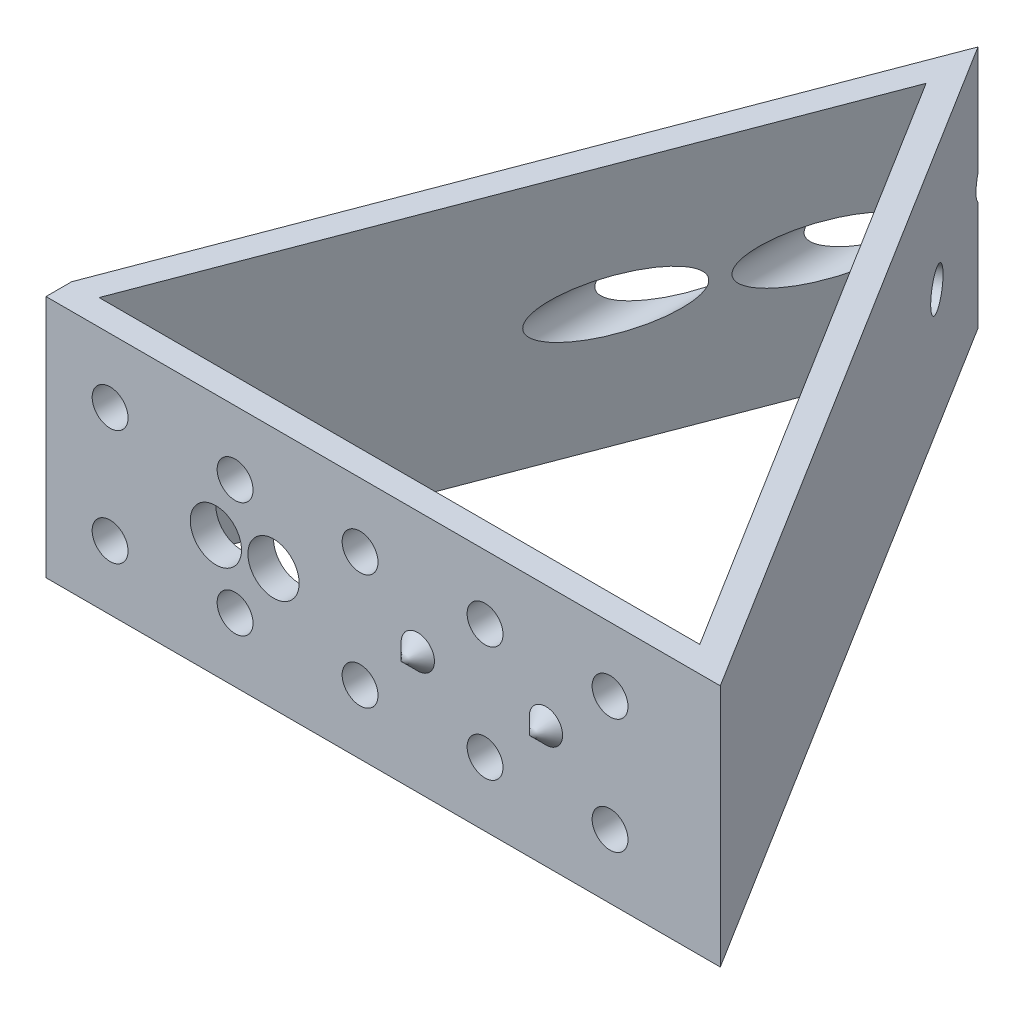
ISO-10303-21;
HEADER;
FILE_DESCRIPTION(('STEP AP214'),'2;1');
FILE_NAME('part.step','',(''),(''),'','','');
FILE_SCHEMA(('AUTOMOTIVE_DESIGN { 1 0 10303 214 1 1 1 1 }'));
ENDSEC;
DATA;
#1=APPLICATION_CONTEXT('core data for automotive mechanical design processes');
#2=APPLICATION_PROTOCOL_DEFINITION('international standard','automotive_design',2000,#1);
#3=PRODUCT_CONTEXT('',#1,'mechanical');
#4=PRODUCT('Part','Part','',(#3));
#5=PRODUCT_RELATED_PRODUCT_CATEGORY('part','',(#4));
#6=PRODUCT_DEFINITION_FORMATION('','',#4);
#7=PRODUCT_DEFINITION_CONTEXT('part definition',#1,'design');
#8=PRODUCT_DEFINITION('design','',#6,#7);
#9=PRODUCT_DEFINITION_SHAPE('','',#8);
#10=(LENGTH_UNIT() NAMED_UNIT(*) SI_UNIT(.MILLI.,.METRE.));
#11=(NAMED_UNIT(*) PLANE_ANGLE_UNIT() SI_UNIT($,.RADIAN.));
#12=(NAMED_UNIT(*) SI_UNIT($,.STERADIAN.) SOLID_ANGLE_UNIT());
#13=UNCERTAINTY_MEASURE_WITH_UNIT(LENGTH_MEASURE(1.E-05),#10,'distance_accuracy_value','');
#14=(GEOMETRIC_REPRESENTATION_CONTEXT(3) GLOBAL_UNCERTAINTY_ASSIGNED_CONTEXT((#13)) GLOBAL_UNIT_ASSIGNED_CONTEXT((#10,
#11,#12)) REPRESENTATION_CONTEXT('',''));
#15=CARTESIAN_POINT('',(0.,0.,0.));
#16=DIRECTION('',(0.,0.,1.));
#17=DIRECTION('',(1.,0.,0.));
#18=AXIS2_PLACEMENT_3D('',#15,#16,#17);
#19=CARTESIAN_POINT('',(-15.5173218956996,30.2385446567147,-17.9808646642624));
#20=DIRECTION('',(0.934610518549132,0.,0.35567285336011));
#21=DIRECTION('',(0.35567285336011,0.,-0.934610518549132));
#22=AXIS2_PLACEMENT_3D('',#19,#20,#21);
#23=PLANE('',#22);
#24=CARTESIAN_POINT('',(-11.25,0.,-29.1942139319328));
#25=DIRECTION('',(0.934610518549132,0.,0.35567285336011));
#26=DIRECTION('',(-0.35567285336011,0.,0.934610518549132));
#27=AXIS2_PLACEMENT_3D('',#24,#25,#26);
#28=ELLIPSE('',#27,5.62314492406608,2.);
#29=CARTESIAN_POINT('',(-13.25,0.,-23.9387635385745));
#30=VERTEX_POINT('',#29);
#31=EDGE_CURVE('E151',#30,#30,#28,.F.);
#32=ORIENTED_EDGE('',*,*,#31,.T.);
#33=EDGE_LOOP('',(#32));
#34=FACE_BOUND('',#33,.T.);
#35=DIRECTION('',(0.35567285336011,0.,-0.934610518549132));
#36=VECTOR('',#35,1.);
#37=CARTESIAN_POINT('',(-15.5173218956996,9.5,-17.9808646642624));
#38=LINE('',#37,#36);
#39=CARTESIAN_POINT('',(-22.3600711630073,9.5,0.));
#40=VERTEX_POINT('',#39);
#41=CARTESIAN_POINT('',(-4.57642849500182,9.49999999999999,-46.7305259274566));
#42=VERTEX_POINT('',#41);
#43=EDGE_CURVE('E139',#40,#42,#38,.T.);
#44=ORIENTED_EDGE('',*,*,#43,.F.);
#45=DIRECTION('',(0.,-1.,0.));
#46=VECTOR('',#45,1.);
#47=CARTESIAN_POINT('',(-22.3600711630073,30.2385446567147,0.));
#48=LINE('',#47,#46);
#49=CARTESIAN_POINT('',(-22.3600711630073,-9.5,0.));
#50=VERTEX_POINT('',#49);
#51=EDGE_CURVE('E54',#40,#50,#48,.T.);
#52=ORIENTED_EDGE('',*,*,#51,.T.);
#53=DIRECTION('',(-0.35567285336011,0.,0.934610518549132));
#54=VECTOR('',#53,1.);
#55=CARTESIAN_POINT('',(-15.5173218956996,-9.5,-17.9808646642624));
#56=LINE('',#55,#54);
#57=CARTESIAN_POINT('',(-4.57642849500182,-9.5,-46.7305259274566));
#58=VERTEX_POINT('',#57);
#59=EDGE_CURVE('E130',#58,#50,#56,.T.);
#60=ORIENTED_EDGE('',*,*,#59,.F.);
#61=DIRECTION('',(0.,-1.,0.));
#62=VECTOR('',#61,1.);
#63=CARTESIAN_POINT('',(-4.57642849500182,79.5050575645304,-46.7305259274566));
#64=LINE('',#63,#62);
#65=EDGE_CURVE('E165',#42,#58,#64,.T.);
#66=ORIENTED_EDGE('',*,*,#65,.F.);
#67=EDGE_LOOP('',(#44,#52,#60,#66));
#68=FACE_BOUND('',#67,.T.);
#69=CARTESIAN_POINT('',(-6.75,0.,-41.018977316989));
#70=DIRECTION('',(0.934610518549132,0.,0.35567285336011));
#71=DIRECTION('',(-0.35567285336011,0.,0.934610518549132));
#72=AXIS2_PLACEMENT_3D('',#69,#70,#71);
#73=ELLIPSE('',#72,5.62314492406608,2.);
#74=CARTESIAN_POINT('',(-8.75,0.,-35.7635269236307));
#75=VERTEX_POINT('',#74);
#76=EDGE_CURVE('E112',#75,#75,#73,.F.);
#77=ORIENTED_EDGE('',*,*,#76,.T.);
#78=EDGE_LOOP('',(#77));
#79=FACE_BOUND('',#78,.T.);
#80=ADVANCED_FACE('F33',(#34,#68,#79),#23,.T.);
#81=CARTESIAN_POINT('',(-24.5,30.2385446567147,0.));
#82=DIRECTION('',(-0.934610518549132,0.,-0.355672853360109));
#83=DIRECTION('',(-0.355672853360109,0.,0.934610518549132));
#84=AXIS2_PLACEMENT_3D('',#81,#82,#83);
#85=PLANE('',#84);
#86=CARTESIAN_POINT('',(-11.25,0.,-34.8173588559989));
#87=DIRECTION('',(-0.934610518549132,0.,-0.355672853360109));
#88=DIRECTION('',(-0.355672853360109,0.,0.934610518549132));
#89=AXIS2_PLACEMENT_3D('',#86,#87,#88);
#90=ELLIPSE('',#89,5.62314492406609,2.);
#91=CARTESIAN_POINT('',(-13.25,0.,-29.5619084626406));
#92=VERTEX_POINT('',#91);
#93=EDGE_CURVE('E149',#92,#92,#90,.F.);
#94=ORIENTED_EDGE('',*,*,#93,.T.);
#95=EDGE_LOOP('',(#94));
#96=FACE_BOUND('',#95,.T.);
#97=DIRECTION('',(0.,-1.,0.));
#98=VECTOR('',#97,1.);
#99=CARTESIAN_POINT('',(-5.01030038253388,79.5050575645304,-51.213574760524));
#100=LINE('',#99,#98);
#101=CARTESIAN_POINT('',(-5.01030038253388,9.49999999999999,-51.213574760524));
#102=VERTEX_POINT('',#101);
#103=CARTESIAN_POINT('',(-5.01030038253388,0.986633285972177,-51.213574760524));
#104=VERTEX_POINT('',#103);
#105=EDGE_CURVE('E111',#102,#104,#100,.T.);
#106=ORIENTED_EDGE('',*,*,#105,.T.);
#107=CARTESIAN_POINT('',(-6.75,0.,-46.6421222410552));
#108=DIRECTION('',(-0.934610518549132,0.,-0.355672853360109));
#109=DIRECTION('',(-0.355672853360109,0.,0.934610518549132));
#110=AXIS2_PLACEMENT_3D('',#107,#108,#109);
#111=ELLIPSE('',#110,5.62314492406608,2.);
#112=CARTESIAN_POINT('',(-5.01030038253389,-0.986633285972183,-51.213574760524));
#113=VERTEX_POINT('',#112);
#114=EDGE_CURVE('E47',#104,#113,#111,.F.);
#115=ORIENTED_EDGE('',*,*,#114,.T.);
#116=CARTESIAN_POINT('',(-5.01030038253388,-9.5,-51.213574760524));
#117=VERTEX_POINT('',#116);
#118=EDGE_CURVE('E109',#113,#117,#100,.T.);
#119=ORIENTED_EDGE('',*,*,#118,.T.);
#120=DIRECTION('',(0.355672853360109,0.,-0.934610518549133));
#121=VECTOR('',#120,1.);
#122=CARTESIAN_POINT('',(-24.5,-9.5,0.));
#123=LINE('',#122,#121);
#124=CARTESIAN_POINT('',(-24.5,-9.5,0.));
#125=VERTEX_POINT('',#124);
#126=EDGE_CURVE('E128',#125,#117,#123,.T.);
#127=ORIENTED_EDGE('',*,*,#126,.F.);
#128=DIRECTION('',(0.,-1.,0.));
#129=VECTOR('',#128,1.);
#130=CARTESIAN_POINT('',(-24.5,9.5,0.));
#131=LINE('',#130,#129);
#132=CARTESIAN_POINT('',(-24.5,9.5,0.));
#133=VERTEX_POINT('',#132);
#134=EDGE_CURVE('E182',#133,#125,#131,.T.);
#135=ORIENTED_EDGE('',*,*,#134,.F.);
#136=DIRECTION('',(-0.355672853360109,0.,0.934610518549132));
#137=VECTOR('',#136,1.);
#138=CARTESIAN_POINT('',(-24.5,9.5,0.));
#139=LINE('',#138,#137);
#140=EDGE_CURVE('E134',#102,#133,#139,.T.);
#141=ORIENTED_EDGE('',*,*,#140,.F.);
#142=EDGE_LOOP('',(#106,#115,#119,#127,#135,#141));
#143=FACE_BOUND('',#142,.T.);
#144=ADVANCED_FACE('F107',(#96,#143),#85,.T.);
#145=CARTESIAN_POINT('',(28.0999775520594,79.5050575645304,2.));
#146=DIRECTION('',(0.849059400777216,0.,-0.528297391581517));
#147=DIRECTION('',(-0.528297391581517,0.,-0.849059400777216));
#148=AXIS2_PLACEMENT_3D('',#145,#146,#147);
#149=PLANE('',#148);
#150=CARTESIAN_POINT('',(0.272673533281302,0.,-42.7229807527518));
#151=DIRECTION('',(0.849059400777216,0.,-0.528297391581517));
#152=DIRECTION('',(-0.528297391581517,0.,-0.849059400777216));
#153=AXIS2_PLACEMENT_3D('',#150,#151,#152);
#154=CIRCLE('',#153,1.5);
#155=CARTESIAN_POINT('',(-0.519772554090975,0.,-43.9965698539176));
#156=VERTEX_POINT('',#155);
#157=EDGE_CURVE('E585',#156,#156,#154,.T.);
#158=ORIENTED_EDGE('',*,*,#157,.F.);
#159=EDGE_LOOP('',(#158));
#160=FACE_BOUND('',#159,.T.);
#161=ORIENTED_EDGE('',*,*,#118,.F.);
#162=CARTESIAN_POINT('',(-6.75,0.,-54.0095535752523));
#163=DIRECTION('',(0.849059400777216,0.,-0.528297391581517));
#164=DIRECTION('',(0.528297391581517,0.,0.849059400777216));
#165=AXIS2_PLACEMENT_3D('',#162,#163,#164);
#166=ELLIPSE('',#165,3.78574649784428,2.);
#167=EDGE_CURVE('E11',#113,#104,#166,.F.);
#168=ORIENTED_EDGE('',*,*,#167,.T.);
#169=ORIENTED_EDGE('',*,*,#105,.F.);
#170=DIRECTION('',(-0.528297391581517,0.,-0.849059400777216));
#171=VECTOR('',#170,1.);
#172=CARTESIAN_POINT('',(28.0999775520594,9.49999999999999,2.));
#173=LINE('',#172,#171);
#174=CARTESIAN_POINT('',(28.0999775520594,9.49999999999999,2.));
#175=VERTEX_POINT('',#174);
#176=EDGE_CURVE('E162',#175,#102,#173,.T.);
#177=ORIENTED_EDGE('',*,*,#176,.F.);
#178=DIRECTION('',(0.,-1.,0.));
#179=VECTOR('',#178,1.);
#180=CARTESIAN_POINT('',(28.0999775520594,79.5050575645304,2.));
#181=LINE('',#180,#179);
#182=CARTESIAN_POINT('',(28.0999775520594,-9.5,2.));
#183=VERTEX_POINT('',#182);
#184=EDGE_CURVE('E122',#175,#183,#181,.T.);
#185=ORIENTED_EDGE('',*,*,#184,.T.);
#186=DIRECTION('',(0.528297391581517,0.,0.849059400777216));
#187=VECTOR('',#186,1.);
#188=CARTESIAN_POINT('',(28.0999775520594,-9.5,2.));
#189=LINE('',#188,#187);
#190=EDGE_CURVE('E119',#117,#183,#189,.T.);
#191=ORIENTED_EDGE('',*,*,#190,.F.);
#192=EDGE_LOOP('',(#161,#168,#169,#177,#185,#191));
#193=FACE_BOUND('',#192,.T.);
#194=ADVANCED_FACE('F116',(#160,#193),#149,.T.);
#195=CARTESIAN_POINT('',(0.,0.,0.));
#196=DIRECTION('',(0.,0.,1.));
#197=DIRECTION('',(1.,0.,0.));
#198=AXIS2_PLACEMENT_3D('',#195,#196,#197);
#199=PLANE('',#198);
#200=CARTESIAN_POINT('',(19.5,4.5,0.));
#201=DIRECTION('',(0.,0.,1.));
#202=DIRECTION('',(1.,0.,0.));
#203=AXIS2_PLACEMENT_3D('',#200,#201,#202);
#204=CIRCLE('',#203,1.4);
#205=CARTESIAN_POINT('',(20.9,4.5,0.));
#206=VERTEX_POINT('',#205);
#207=EDGE_CURVE('E185',#206,#206,#204,.T.);
#208=ORIENTED_EDGE('',*,*,#207,.T.);
#209=EDGE_LOOP('',(#208));
#210=FACE_BOUND('',#209,.T.);
#211=CARTESIAN_POINT('',(9.75,4.5,0.));
#212=DIRECTION('',(0.,0.,1.));
#213=DIRECTION('',(1.,0.,0.));
#214=AXIS2_PLACEMENT_3D('',#211,#212,#213);
#215=CIRCLE('',#214,1.4);
#216=CARTESIAN_POINT('',(11.15,4.5,0.));
#217=VERTEX_POINT('',#216);
#218=EDGE_CURVE('E218',#217,#217,#215,.T.);
#219=ORIENTED_EDGE('',*,*,#218,.T.);
#220=EDGE_LOOP('',(#219));
#221=FACE_BOUND('',#220,.T.);
#222=CARTESIAN_POINT('',(0.,4.5,0.));
#223=DIRECTION('',(0.,0.,1.));
#224=DIRECTION('',(1.,0.,0.));
#225=AXIS2_PLACEMENT_3D('',#222,#223,#224);
#226=CIRCLE('',#225,1.4);
#227=CARTESIAN_POINT('',(1.4,4.5,0.));
#228=VERTEX_POINT('',#227);
#229=EDGE_CURVE('E223',#228,#228,#226,.T.);
#230=ORIENTED_EDGE('',*,*,#229,.T.);
#231=EDGE_LOOP('',(#230));
#232=FACE_BOUND('',#231,.T.);
#233=CARTESIAN_POINT('',(-9.75,4.5,0.));
#234=DIRECTION('',(0.,0.,1.));
#235=DIRECTION('',(1.,0.,0.));
#236=AXIS2_PLACEMENT_3D('',#233,#234,#235);
#237=CIRCLE('',#236,1.4);
#238=CARTESIAN_POINT('',(-8.35,4.5,0.));
#239=VERTEX_POINT('',#238);
#240=EDGE_CURVE('E229',#239,#239,#237,.T.);
#241=ORIENTED_EDGE('',*,*,#240,.T.);
#242=EDGE_LOOP('',(#241));
#243=FACE_BOUND('',#242,.T.);
#244=CARTESIAN_POINT('',(-19.5,4.5,0.));
#245=DIRECTION('',(0.,0.,1.));
#246=DIRECTION('',(1.,0.,0.));
#247=AXIS2_PLACEMENT_3D('',#244,#245,#246);
#248=CIRCLE('',#247,1.4);
#249=CARTESIAN_POINT('',(-18.1,4.5,0.));
#250=VERTEX_POINT('',#249);
#251=EDGE_CURVE('E235',#250,#250,#248,.T.);
#252=ORIENTED_EDGE('',*,*,#251,.T.);
#253=EDGE_LOOP('',(#252));
#254=FACE_BOUND('',#253,.T.);
#255=CARTESIAN_POINT('',(-19.5,-4.5,0.));
#256=DIRECTION('',(0.,0.,1.));
#257=DIRECTION('',(1.,0.,0.));
#258=AXIS2_PLACEMENT_3D('',#255,#256,#257);
#259=CIRCLE('',#258,1.4);
#260=CARTESIAN_POINT('',(-18.1,-4.5,0.));
#261=VERTEX_POINT('',#260);
#262=EDGE_CURVE('E241',#261,#261,#259,.T.);
#263=ORIENTED_EDGE('',*,*,#262,.T.);
#264=EDGE_LOOP('',(#263));
#265=FACE_BOUND('',#264,.T.);
#266=CARTESIAN_POINT('',(-9.75,-4.5,0.));
#267=DIRECTION('',(0.,0.,1.));
#268=DIRECTION('',(1.,0.,0.));
#269=AXIS2_PLACEMENT_3D('',#266,#267,#268);
#270=CIRCLE('',#269,1.4);
#271=CARTESIAN_POINT('',(-8.35,-4.5,0.));
#272=VERTEX_POINT('',#271);
#273=EDGE_CURVE('E247',#272,#272,#270,.T.);
#274=ORIENTED_EDGE('',*,*,#273,.T.);
#275=EDGE_LOOP('',(#274));
#276=FACE_BOUND('',#275,.T.);
#277=CARTESIAN_POINT('',(0.,-4.5,0.));
#278=DIRECTION('',(0.,0.,1.));
#279=DIRECTION('',(1.,0.,0.));
#280=AXIS2_PLACEMENT_3D('',#277,#278,#279);
#281=CIRCLE('',#280,1.4);
#282=CARTESIAN_POINT('',(1.4,-4.5,0.));
#283=VERTEX_POINT('',#282);
#284=EDGE_CURVE('E253',#283,#283,#281,.T.);
#285=ORIENTED_EDGE('',*,*,#284,.T.);
#286=EDGE_LOOP('',(#285));
#287=FACE_BOUND('',#286,.T.);
#288=CARTESIAN_POINT('',(9.75,-4.5,0.));
#289=DIRECTION('',(0.,0.,1.));
#290=DIRECTION('',(1.,0.,0.));
#291=AXIS2_PLACEMENT_3D('',#288,#289,#290);
#292=CIRCLE('',#291,1.4);
#293=CARTESIAN_POINT('',(11.15,-4.5,0.));
#294=VERTEX_POINT('',#293);
#295=EDGE_CURVE('E259',#294,#294,#292,.T.);
#296=ORIENTED_EDGE('',*,*,#295,.T.);
#297=EDGE_LOOP('',(#296));
#298=FACE_BOUND('',#297,.T.);
#299=CARTESIAN_POINT('',(19.5,-4.5,0.));
#300=DIRECTION('',(0.,0.,1.));
#301=DIRECTION('',(1.,0.,0.));
#302=AXIS2_PLACEMENT_3D('',#299,#300,#301);
#303=CIRCLE('',#302,1.4);
#304=CARTESIAN_POINT('',(20.9,-4.5,0.));
#305=VERTEX_POINT('',#304);
#306=EDGE_CURVE('E265',#305,#305,#303,.T.);
#307=ORIENTED_EDGE('',*,*,#306,.T.);
#308=EDGE_LOOP('',(#307));
#309=FACE_BOUND('',#308,.T.);
#310=CARTESIAN_POINT('',(-6.75,0.,0.));
#311=DIRECTION('',(0.,0.,1.));
#312=DIRECTION('',(1.,0.,0.));
#313=AXIS2_PLACEMENT_3D('',#310,#311,#312);
#314=CIRCLE('',#313,2.);
#315=CARTESIAN_POINT('',(-4.75,0.,0.));
#316=VERTEX_POINT('',#315);
#317=EDGE_CURVE('E210',#316,#316,#314,.T.);
#318=ORIENTED_EDGE('',*,*,#317,.T.);
#319=EDGE_LOOP('',(#318));
#320=FACE_BOUND('',#319,.T.);
#321=CARTESIAN_POINT('',(-11.25,0.,0.));
#322=DIRECTION('',(0.,0.,1.));
#323=DIRECTION('',(1.,0.,0.));
#324=AXIS2_PLACEMENT_3D('',#321,#322,#323);
#325=CIRCLE('',#324,2.);
#326=CARTESIAN_POINT('',(-9.25,0.,0.));
#327=VERTEX_POINT('',#326);
#328=EDGE_CURVE('E205',#327,#327,#325,.T.);
#329=ORIENTED_EDGE('',*,*,#328,.T.);
#330=EDGE_LOOP('',(#329));
#331=FACE_BOUND('',#330,.T.);
#332=ORIENTED_EDGE('',*,*,#51,.F.);
#333=DIRECTION('',(-1.,0.,0.));
#334=VECTOR('',#333,1.);
#335=CARTESIAN_POINT('',(-24.5,9.5,0.));
#336=LINE('',#335,#334);
#337=CARTESIAN_POINT('',(24.5,9.5,0.));
#338=VERTEX_POINT('',#337);
#339=EDGE_CURVE('E198',#338,#40,#336,.T.);
#340=ORIENTED_EDGE('',*,*,#339,.F.);
#341=DIRECTION('',(0.,1.,0.));
#342=VECTOR('',#341,1.);
#343=CARTESIAN_POINT('',(24.5,9.5,0.));
#344=LINE('',#343,#342);
#345=CARTESIAN_POINT('',(24.5,-9.5,0.));
#346=VERTEX_POINT('',#345);
#347=EDGE_CURVE('E188',#346,#338,#344,.T.);
#348=ORIENTED_EDGE('',*,*,#347,.F.);
#349=DIRECTION('',(1.,0.,0.));
#350=VECTOR('',#349,1.);
#351=CARTESIAN_POINT('',(-24.5,-9.5,0.));
#352=LINE('',#351,#350);
#353=EDGE_CURVE('E140',#50,#346,#352,.T.);
#354=ORIENTED_EDGE('',*,*,#353,.F.);
#355=EDGE_LOOP('',(#332,#340,#348,#354));
#356=FACE_BOUND('',#355,.T.);
#357=ADVANCED_FACE('F288',(#210,#221,#232,#243,#254,#265,#276,#287,#298,#309,#320,#331,#356),
#199,.F.);
#358=CARTESIAN_POINT('',(0.,0.,2.));
#359=DIRECTION('',(0.,0.,1.));
#360=DIRECTION('',(1.,0.,0.));
#361=AXIS2_PLACEMENT_3D('',#358,#359,#360);
#362=PLANE('',#361);
#363=CARTESIAN_POINT('',(4.5,0.,2.));
#364=DIRECTION('',(0.,0.,1.));
#365=DIRECTION('',(1.,0.,0.));
#366=AXIS2_PLACEMENT_3D('',#363,#364,#365);
#367=CIRCLE('',#366,1.3);
#368=CARTESIAN_POINT('',(5.8,0.,2.));
#369=VERTEX_POINT('',#368);
#370=EDGE_CURVE('E276',#369,#369,#367,.T.);
#371=ORIENTED_EDGE('',*,*,#370,.F.);
#372=EDGE_LOOP('',(#371));
#373=FACE_BOUND('',#372,.T.);
#374=CARTESIAN_POINT('',(-11.25,0.,2.));
#375=DIRECTION('',(0.,0.,1.));
#376=DIRECTION('',(1.,0.,0.));
#377=AXIS2_PLACEMENT_3D('',#374,#375,#376);
#378=CIRCLE('',#377,2.);
#379=CARTESIAN_POINT('',(-9.25,0.,2.));
#380=VERTEX_POINT('',#379);
#381=EDGE_CURVE('E209',#380,#380,#378,.T.);
#382=ORIENTED_EDGE('',*,*,#381,.F.);
#383=EDGE_LOOP('',(#382));
#384=FACE_BOUND('',#383,.T.);
#385=CARTESIAN_POINT('',(-6.75,0.,2.));
#386=DIRECTION('',(0.,0.,1.));
#387=DIRECTION('',(1.,0.,0.));
#388=AXIS2_PLACEMENT_3D('',#385,#386,#387);
#389=CIRCLE('',#388,2.);
#390=CARTESIAN_POINT('',(-4.75,0.,2.));
#391=VERTEX_POINT('',#390);
#392=EDGE_CURVE('E208',#391,#391,#389,.T.);
#393=ORIENTED_EDGE('',*,*,#392,.F.);
#394=EDGE_LOOP('',(#393));
#395=FACE_BOUND('',#394,.T.);
#396=CARTESIAN_POINT('',(19.5,-4.5,2.));
#397=DIRECTION('',(0.,0.,1.));
#398=DIRECTION('',(1.,0.,0.));
#399=AXIS2_PLACEMENT_3D('',#396,#397,#398);
#400=CIRCLE('',#399,1.4);
#401=CARTESIAN_POINT('',(20.9,-4.5,2.));
#402=VERTEX_POINT('',#401);
#403=EDGE_CURVE('E212',#402,#402,#400,.T.);
#404=ORIENTED_EDGE('',*,*,#403,.F.);
#405=EDGE_LOOP('',(#404));
#406=FACE_BOUND('',#405,.T.);
#407=CARTESIAN_POINT('',(9.75,-4.5,2.));
#408=DIRECTION('',(0.,0.,1.));
#409=DIRECTION('',(1.,0.,0.));
#410=AXIS2_PLACEMENT_3D('',#407,#408,#409);
#411=CIRCLE('',#410,1.4);
#412=CARTESIAN_POINT('',(11.15,-4.5,2.));
#413=VERTEX_POINT('',#412);
#414=EDGE_CURVE('E262',#413,#413,#411,.T.);
#415=ORIENTED_EDGE('',*,*,#414,.F.);
#416=EDGE_LOOP('',(#415));
#417=FACE_BOUND('',#416,.T.);
#418=CARTESIAN_POINT('',(0.,-4.5,2.));
#419=DIRECTION('',(0.,0.,1.));
#420=DIRECTION('',(1.,0.,0.));
#421=AXIS2_PLACEMENT_3D('',#418,#419,#420);
#422=CIRCLE('',#421,1.4);
#423=CARTESIAN_POINT('',(1.4,-4.5,2.));
#424=VERTEX_POINT('',#423);
#425=EDGE_CURVE('E256',#424,#424,#422,.T.);
#426=ORIENTED_EDGE('',*,*,#425,.F.);
#427=EDGE_LOOP('',(#426));
#428=FACE_BOUND('',#427,.T.);
#429=CARTESIAN_POINT('',(-9.75,-4.5,2.));
#430=DIRECTION('',(0.,0.,1.));
#431=DIRECTION('',(1.,0.,0.));
#432=AXIS2_PLACEMENT_3D('',#429,#430,#431);
#433=CIRCLE('',#432,1.4);
#434=CARTESIAN_POINT('',(-8.35,-4.5,2.));
#435=VERTEX_POINT('',#434);
#436=EDGE_CURVE('E250',#435,#435,#433,.T.);
#437=ORIENTED_EDGE('',*,*,#436,.F.);
#438=EDGE_LOOP('',(#437));
#439=FACE_BOUND('',#438,.T.);
#440=CARTESIAN_POINT('',(-19.5,-4.5,2.));
#441=DIRECTION('',(0.,0.,1.));
#442=DIRECTION('',(1.,0.,0.));
#443=AXIS2_PLACEMENT_3D('',#440,#441,#442);
#444=CIRCLE('',#443,1.4);
#445=CARTESIAN_POINT('',(-18.1,-4.5,2.));
#446=VERTEX_POINT('',#445);
#447=EDGE_CURVE('E244',#446,#446,#444,.T.);
#448=ORIENTED_EDGE('',*,*,#447,.F.);
#449=EDGE_LOOP('',(#448));
#450=FACE_BOUND('',#449,.T.);
#451=CARTESIAN_POINT('',(-19.5,4.5,2.));
#452=DIRECTION('',(0.,0.,1.));
#453=DIRECTION('',(1.,0.,0.));
#454=AXIS2_PLACEMENT_3D('',#451,#452,#453);
#455=CIRCLE('',#454,1.4);
#456=CARTESIAN_POINT('',(-18.1,4.5,2.));
#457=VERTEX_POINT('',#456);
#458=EDGE_CURVE('E238',#457,#457,#455,.T.);
#459=ORIENTED_EDGE('',*,*,#458,.F.);
#460=EDGE_LOOP('',(#459));
#461=FACE_BOUND('',#460,.T.);
#462=CARTESIAN_POINT('',(-9.75,4.5,2.));
#463=DIRECTION('',(0.,0.,1.));
#464=DIRECTION('',(1.,0.,0.));
#465=AXIS2_PLACEMENT_3D('',#462,#463,#464);
#466=CIRCLE('',#465,1.4);
#467=CARTESIAN_POINT('',(-8.35,4.5,2.));
#468=VERTEX_POINT('',#467);
#469=EDGE_CURVE('E232',#468,#468,#466,.T.);
#470=ORIENTED_EDGE('',*,*,#469,.F.);
#471=EDGE_LOOP('',(#470));
#472=FACE_BOUND('',#471,.T.);
#473=CARTESIAN_POINT('',(0.,4.5,2.));
#474=DIRECTION('',(0.,0.,1.));
#475=DIRECTION('',(1.,0.,0.));
#476=AXIS2_PLACEMENT_3D('',#473,#474,#475);
#477=CIRCLE('',#476,1.4);
#478=CARTESIAN_POINT('',(1.4,4.5,2.));
#479=VERTEX_POINT('',#478);
#480=EDGE_CURVE('E226',#479,#479,#477,.T.);
#481=ORIENTED_EDGE('',*,*,#480,.F.);
#482=EDGE_LOOP('',(#481));
#483=FACE_BOUND('',#482,.T.);
#484=CARTESIAN_POINT('',(9.75,4.5,2.));
#485=DIRECTION('',(0.,0.,1.));
#486=DIRECTION('',(1.,0.,0.));
#487=AXIS2_PLACEMENT_3D('',#484,#485,#486);
#488=CIRCLE('',#487,1.4);
#489=CARTESIAN_POINT('',(11.15,4.5,2.));
#490=VERTEX_POINT('',#489);
#491=EDGE_CURVE('E220',#490,#490,#488,.T.);
#492=ORIENTED_EDGE('',*,*,#491,.F.);
#493=EDGE_LOOP('',(#492));
#494=FACE_BOUND('',#493,.T.);
#495=CARTESIAN_POINT('',(19.5,4.5,2.));
#496=DIRECTION('',(0.,0.,1.));
#497=DIRECTION('',(1.,0.,0.));
#498=AXIS2_PLACEMENT_3D('',#495,#496,#497);
#499=CIRCLE('',#498,1.4);
#500=CARTESIAN_POINT('',(20.9,4.5,2.));
#501=VERTEX_POINT('',#500);
#502=EDGE_CURVE('E190',#501,#501,#499,.T.);
#503=ORIENTED_EDGE('',*,*,#502,.F.);
#504=EDGE_LOOP('',(#503));
#505=FACE_BOUND('',#504,.T.);
#506=DIRECTION('',(0.,-1.,0.));
#507=VECTOR('',#506,1.);
#508=CARTESIAN_POINT('',(-24.5,9.5,2.));
#509=LINE('',#508,#507);
#510=CARTESIAN_POINT('',(-24.5,9.5,2.));
#511=VERTEX_POINT('',#510);
#512=CARTESIAN_POINT('',(-24.5,-9.5,2.));
#513=VERTEX_POINT('',#512);
#514=EDGE_CURVE('E204',#511,#513,#509,.T.);
#515=ORIENTED_EDGE('',*,*,#514,.T.);
#516=DIRECTION('',(1.,0.,0.));
#517=VECTOR('',#516,1.);
#518=CARTESIAN_POINT('',(-24.5,-9.5,2.));
#519=LINE('',#518,#517);
#520=EDGE_CURVE('E177',#513,#183,#519,.T.);
#521=ORIENTED_EDGE('',*,*,#520,.T.);
#522=ORIENTED_EDGE('',*,*,#184,.F.);
#523=DIRECTION('',(-1.,0.,0.));
#524=VECTOR('',#523,1.);
#525=CARTESIAN_POINT('',(-24.5,9.5,2.));
#526=LINE('',#525,#524);
#527=EDGE_CURVE('E193',#175,#511,#526,.T.);
#528=ORIENTED_EDGE('',*,*,#527,.T.);
#529=EDGE_LOOP('',(#515,#521,#522,#528));
#530=FACE_BOUND('',#529,.T.);
#531=CARTESIAN_POINT('',(14.5,0.,2.));
#532=DIRECTION('',(0.,0.,1.));
#533=DIRECTION('',(1.,0.,0.));
#534=AXIS2_PLACEMENT_3D('',#531,#532,#533);
#535=CIRCLE('',#534,1.3);
#536=CARTESIAN_POINT('',(15.8,0.,2.));
#537=VERTEX_POINT('',#536);
#538=EDGE_CURVE('E278',#537,#537,#535,.T.);
#539=ORIENTED_EDGE('',*,*,#538,.F.);
#540=EDGE_LOOP('',(#539));
#541=FACE_BOUND('',#540,.T.);
#542=ADVANCED_FACE('F285',(#373,#384,#395,#406,#417,#428,#439,#450,#461,#472,#483,#494,#505,
#530,#541),#362,.T.);
#543=CARTESIAN_POINT('',(-24.5,9.5,2.));
#544=DIRECTION('',(1.,0.,0.));
#545=DIRECTION('',(0.,0.,-1.));
#546=AXIS2_PLACEMENT_3D('',#543,#544,#545);
#547=PLANE('',#546);
#548=ORIENTED_EDGE('',*,*,#134,.T.);
#549=DIRECTION('',(0.,0.,-1.));
#550=VECTOR('',#549,1.);
#551=CARTESIAN_POINT('',(-24.5,-9.5,2.));
#552=LINE('',#551,#550);
#553=EDGE_CURVE('E41',#513,#125,#552,.T.);
#554=ORIENTED_EDGE('',*,*,#553,.F.);
#555=ORIENTED_EDGE('',*,*,#514,.F.);
#556=DIRECTION('',(0.,0.,-1.));
#557=VECTOR('',#556,1.);
#558=CARTESIAN_POINT('',(-24.5,9.5,2.));
#559=LINE('',#558,#557);
#560=EDGE_CURVE('E201',#511,#133,#559,.T.);
#561=ORIENTED_EDGE('',*,*,#560,.T.);
#562=EDGE_LOOP('',(#548,#554,#555,#561));
#563=FACE_BOUND('',#562,.T.);
#564=ADVANCED_FACE('F284',(#563),#547,.F.);
#565=CARTESIAN_POINT('',(-24.5,-9.5,2.));
#566=DIRECTION('',(0.,1.,0.));
#567=DIRECTION('',(0.,0.,1.));
#568=AXIS2_PLACEMENT_3D('',#565,#566,#567);
#569=PLANE('',#568);
#570=ORIENTED_EDGE('',*,*,#353,.T.);
#571=DIRECTION('',(-0.528297391581518,0.,-0.849059400777216));
#572=VECTOR('',#571,1.);
#573=CARTESIAN_POINT('',(-4.57642849500182,-9.5,-46.7305259274566));
#574=LINE('',#573,#572);
#575=EDGE_CURVE('E120',#346,#58,#574,.T.);
#576=ORIENTED_EDGE('',*,*,#575,.T.);
#577=ORIENTED_EDGE('',*,*,#59,.T.);
#578=EDGE_LOOP('',(#570,#576,#577));
#579=FACE_BOUND('',#578,.T.);
#580=ORIENTED_EDGE('',*,*,#553,.T.);
#581=ORIENTED_EDGE('',*,*,#126,.T.);
#582=ORIENTED_EDGE('',*,*,#190,.T.);
#583=ORIENTED_EDGE('',*,*,#520,.F.);
#584=EDGE_LOOP('',(#580,#581,#582,#583));
#585=FACE_BOUND('',#584,.T.);
#586=ADVANCED_FACE('F176',(#579,#585),#569,.F.);
#587=CARTESIAN_POINT('',(-24.5,9.5,2.));
#588=DIRECTION('',(0.,-1.,0.));
#589=DIRECTION('',(0.,0.,-1.));
#590=AXIS2_PLACEMENT_3D('',#587,#588,#589);
#591=PLANE('',#590);
#592=DIRECTION('',(0.528297391581518,0.,0.849059400777216));
#593=VECTOR('',#592,1.);
#594=CARTESIAN_POINT('',(-4.57642849500182,9.49999999999999,-46.7305259274566));
#595=LINE('',#594,#593);
#596=EDGE_CURVE('E131',#42,#338,#595,.T.);
#597=ORIENTED_EDGE('',*,*,#596,.T.);
#598=ORIENTED_EDGE('',*,*,#339,.T.);
#599=ORIENTED_EDGE('',*,*,#43,.T.);
#600=EDGE_LOOP('',(#597,#598,#599));
#601=FACE_BOUND('',#600,.T.);
#602=ORIENTED_EDGE('',*,*,#527,.F.);
#603=ORIENTED_EDGE('',*,*,#176,.T.);
#604=ORIENTED_EDGE('',*,*,#140,.T.);
#605=ORIENTED_EDGE('',*,*,#560,.F.);
#606=EDGE_LOOP('',(#602,#603,#604,#605));
#607=FACE_BOUND('',#606,.T.);
#608=ADVANCED_FACE('F283',(#601,#607),#591,.F.);
#609=CARTESIAN_POINT('',(19.5,4.5,0.));
#610=DIRECTION('',(0.,0.,1.));
#611=DIRECTION('',(1.,0.,0.));
#612=AXIS2_PLACEMENT_3D('',#609,#610,#611);
#613=CYLINDRICAL_SURFACE('',#612,1.4);
#614=ORIENTED_EDGE('',*,*,#207,.F.);
#615=EDGE_LOOP('',(#614));
#616=FACE_BOUND('',#615,.T.);
#617=ORIENTED_EDGE('',*,*,#502,.T.);
#618=EDGE_LOOP('',(#617));
#619=FACE_BOUND('',#618,.T.);
#620=ADVANCED_FACE('F357',(#616,#619),#613,.F.);
#621=CARTESIAN_POINT('',(9.75,4.5,0.));
#622=DIRECTION('',(0.,0.,1.));
#623=DIRECTION('',(1.,0.,0.));
#624=AXIS2_PLACEMENT_3D('',#621,#622,#623);
#625=CYLINDRICAL_SURFACE('',#624,1.4);
#626=ORIENTED_EDGE('',*,*,#218,.F.);
#627=EDGE_LOOP('',(#626));
#628=FACE_BOUND('',#627,.T.);
#629=ORIENTED_EDGE('',*,*,#491,.T.);
#630=EDGE_LOOP('',(#629));
#631=FACE_BOUND('',#630,.T.);
#632=ADVANCED_FACE('F354',(#628,#631),#625,.F.);
#633=CARTESIAN_POINT('',(0.,4.5,0.));
#634=DIRECTION('',(0.,0.,1.));
#635=DIRECTION('',(1.,0.,0.));
#636=AXIS2_PLACEMENT_3D('',#633,#634,#635);
#637=CYLINDRICAL_SURFACE('',#636,1.4);
#638=ORIENTED_EDGE('',*,*,#229,.F.);
#639=EDGE_LOOP('',(#638));
#640=FACE_BOUND('',#639,.T.);
#641=ORIENTED_EDGE('',*,*,#480,.T.);
#642=EDGE_LOOP('',(#641));
#643=FACE_BOUND('',#642,.T.);
#644=ADVANCED_FACE('F350',(#640,#643),#637,.F.);
#645=CARTESIAN_POINT('',(-9.75,4.5,0.));
#646=DIRECTION('',(0.,0.,1.));
#647=DIRECTION('',(1.,0.,0.));
#648=AXIS2_PLACEMENT_3D('',#645,#646,#647);
#649=CYLINDRICAL_SURFACE('',#648,1.4);
#650=ORIENTED_EDGE('',*,*,#240,.F.);
#651=EDGE_LOOP('',(#650));
#652=FACE_BOUND('',#651,.T.);
#653=ORIENTED_EDGE('',*,*,#469,.T.);
#654=EDGE_LOOP('',(#653));
#655=FACE_BOUND('',#654,.T.);
#656=ADVANCED_FACE('F346',(#652,#655),#649,.F.);
#657=CARTESIAN_POINT('',(-19.5,4.5,0.));
#658=DIRECTION('',(0.,0.,1.));
#659=DIRECTION('',(1.,0.,0.));
#660=AXIS2_PLACEMENT_3D('',#657,#658,#659);
#661=CYLINDRICAL_SURFACE('',#660,1.4);
#662=ORIENTED_EDGE('',*,*,#251,.F.);
#663=EDGE_LOOP('',(#662));
#664=FACE_BOUND('',#663,.T.);
#665=ORIENTED_EDGE('',*,*,#458,.T.);
#666=EDGE_LOOP('',(#665));
#667=FACE_BOUND('',#666,.T.);
#668=ADVANCED_FACE('F342',(#664,#667),#661,.F.);
#669=CARTESIAN_POINT('',(-19.5,-4.5,0.));
#670=DIRECTION('',(0.,0.,1.));
#671=DIRECTION('',(1.,0.,0.));
#672=AXIS2_PLACEMENT_3D('',#669,#670,#671);
#673=CYLINDRICAL_SURFACE('',#672,1.4);
#674=ORIENTED_EDGE('',*,*,#262,.F.);
#675=EDGE_LOOP('',(#674));
#676=FACE_BOUND('',#675,.T.);
#677=ORIENTED_EDGE('',*,*,#447,.T.);
#678=EDGE_LOOP('',(#677));
#679=FACE_BOUND('',#678,.T.);
#680=ADVANCED_FACE('F338',(#676,#679),#673,.F.);
#681=CARTESIAN_POINT('',(-9.75,-4.5,0.));
#682=DIRECTION('',(0.,0.,1.));
#683=DIRECTION('',(1.,0.,0.));
#684=AXIS2_PLACEMENT_3D('',#681,#682,#683);
#685=CYLINDRICAL_SURFACE('',#684,1.4);
#686=ORIENTED_EDGE('',*,*,#273,.F.);
#687=EDGE_LOOP('',(#686));
#688=FACE_BOUND('',#687,.T.);
#689=ORIENTED_EDGE('',*,*,#436,.T.);
#690=EDGE_LOOP('',(#689));
#691=FACE_BOUND('',#690,.T.);
#692=ADVANCED_FACE('F334',(#688,#691),#685,.F.);
#693=CARTESIAN_POINT('',(0.,-4.5,0.));
#694=DIRECTION('',(0.,0.,1.));
#695=DIRECTION('',(1.,0.,0.));
#696=AXIS2_PLACEMENT_3D('',#693,#694,#695);
#697=CYLINDRICAL_SURFACE('',#696,1.4);
#698=ORIENTED_EDGE('',*,*,#284,.F.);
#699=EDGE_LOOP('',(#698));
#700=FACE_BOUND('',#699,.T.);
#701=ORIENTED_EDGE('',*,*,#425,.T.);
#702=EDGE_LOOP('',(#701));
#703=FACE_BOUND('',#702,.T.);
#704=ADVANCED_FACE('F330',(#700,#703),#697,.F.);
#705=CARTESIAN_POINT('',(9.75,-4.5,0.));
#706=DIRECTION('',(0.,0.,1.));
#707=DIRECTION('',(1.,0.,0.));
#708=AXIS2_PLACEMENT_3D('',#705,#706,#707);
#709=CYLINDRICAL_SURFACE('',#708,1.4);
#710=ORIENTED_EDGE('',*,*,#295,.F.);
#711=EDGE_LOOP('',(#710));
#712=FACE_BOUND('',#711,.T.);
#713=ORIENTED_EDGE('',*,*,#414,.T.);
#714=EDGE_LOOP('',(#713));
#715=FACE_BOUND('',#714,.T.);
#716=ADVANCED_FACE('F326',(#712,#715),#709,.F.);
#717=CARTESIAN_POINT('',(19.5,-4.5,0.));
#718=DIRECTION('',(0.,0.,1.));
#719=DIRECTION('',(1.,0.,0.));
#720=AXIS2_PLACEMENT_3D('',#717,#718,#719);
#721=CYLINDRICAL_SURFACE('',#720,1.4);
#722=ORIENTED_EDGE('',*,*,#306,.F.);
#723=EDGE_LOOP('',(#722));
#724=FACE_BOUND('',#723,.T.);
#725=ORIENTED_EDGE('',*,*,#403,.T.);
#726=EDGE_LOOP('',(#725));
#727=FACE_BOUND('',#726,.T.);
#728=ADVANCED_FACE('F322',(#724,#727),#721,.F.);
#729=CARTESIAN_POINT('',(-6.75,0.,-8.));
#730=DIRECTION('',(0.,0.,1.));
#731=DIRECTION('',(1.,0.,0.));
#732=AXIS2_PLACEMENT_3D('',#729,#730,#731);
#733=CYLINDRICAL_SURFACE('',#732,2.);
#734=ORIENTED_EDGE('',*,*,#392,.T.);
#735=EDGE_LOOP('',(#734));
#736=FACE_BOUND('',#735,.T.);
#737=ORIENTED_EDGE('',*,*,#317,.F.);
#738=EDGE_LOOP('',(#737));
#739=FACE_BOUND('',#738,.T.);
#740=ADVANCED_FACE('F318',(#736,#739),#733,.F.);
#741=CARTESIAN_POINT('',(-11.25,0.,-8.));
#742=DIRECTION('',(0.,0.,1.));
#743=DIRECTION('',(1.,0.,0.));
#744=AXIS2_PLACEMENT_3D('',#741,#742,#743);
#745=CYLINDRICAL_SURFACE('',#744,2.);
#746=ORIENTED_EDGE('',*,*,#381,.T.);
#747=EDGE_LOOP('',(#746));
#748=FACE_BOUND('',#747,.T.);
#749=ORIENTED_EDGE('',*,*,#328,.F.);
#750=EDGE_LOOP('',(#749));
#751=FACE_BOUND('',#750,.T.);
#752=ADVANCED_FACE('F315',(#748,#751),#745,.F.);
#753=CARTESIAN_POINT('',(4.5,0.,2.));
#754=DIRECTION('',(0.,0.,-1.));
#755=DIRECTION('',(1.,0.,0.));
#756=AXIS2_PLACEMENT_3D('',#753,#754,#755);
#757=CONICAL_SURFACE('',#756,1.3,0.78539816339745);
#758=CARTESIAN_POINT('',(4.5,0.,3.3));
#759=VERTEX_POINT('',#758);
#760=VERTEX_LOOP('',#759);
#761=FACE_BOUND('',#760,.T.);
#762=ORIENTED_EDGE('',*,*,#370,.T.);
#763=EDGE_LOOP('',(#762));
#764=FACE_BOUND('',#763,.T.);
#765=ADVANCED_FACE('F35',(#761,#764),#757,.T.);
#766=CARTESIAN_POINT('',(14.5,0.,2.));
#767=DIRECTION('',(0.,0.,-1.));
#768=DIRECTION('',(1.,0.,0.));
#769=AXIS2_PLACEMENT_3D('',#766,#767,#768);
#770=CONICAL_SURFACE('',#769,1.3,0.78539816339745);
#771=CARTESIAN_POINT('',(14.5,0.,3.3));
#772=VERTEX_POINT('',#771);
#773=VERTEX_LOOP('',#772);
#774=FACE_BOUND('',#773,.T.);
#775=ORIENTED_EDGE('',*,*,#538,.T.);
#776=EDGE_LOOP('',(#775));
#777=FACE_BOUND('',#776,.T.);
#778=ADVANCED_FACE('F426',(#774,#777),#770,.T.);
#779=CARTESIAN_POINT('',(-4.57642849500182,79.5050575645304,-46.7305259274566));
#780=DIRECTION('',(-0.849059400777216,0.,0.528297391581518));
#781=DIRECTION('',(0.528297391581518,0.,0.849059400777216));
#782=AXIS2_PLACEMENT_3D('',#779,#780,#781);
#783=PLANE('',#782);
#784=CARTESIAN_POINT('',(-1.42544526827314,0.,-41.6663859695888));
#785=DIRECTION('',(-0.849059400777216,0.,0.528297391581518));
#786=DIRECTION('',(0.528297391581518,0.,0.849059400777216));
#787=AXIS2_PLACEMENT_3D('',#784,#785,#786);
#788=CIRCLE('',#787,1.5);
#789=CARTESIAN_POINT('',(-0.63299918090086,0.,-40.392796868423));
#790=VERTEX_POINT('',#789);
#791=EDGE_CURVE('E113',#790,#790,#788,.F.);
#792=ORIENTED_EDGE('',*,*,#791,.T.);
#793=EDGE_LOOP('',(#792));
#794=FACE_BOUND('',#793,.T.);
#795=ORIENTED_EDGE('',*,*,#596,.F.);
#796=ORIENTED_EDGE('',*,*,#65,.T.);
#797=ORIENTED_EDGE('',*,*,#575,.F.);
#798=ORIENTED_EDGE('',*,*,#347,.T.);
#799=EDGE_LOOP('',(#795,#796,#797,#798));
#800=FACE_BOUND('',#799,.T.);
#801=ADVANCED_FACE('F427',(#794,#800),#783,.T.);
#802=CARTESIAN_POINT('',(-11.25,0.,-51.213574760524));
#803=DIRECTION('',(0.,0.,1.));
#804=DIRECTION('',(1.,0.,0.));
#805=AXIS2_PLACEMENT_3D('',#802,#803,#804);
#806=CYLINDRICAL_SURFACE('',#805,2.);
#807=ORIENTED_EDGE('',*,*,#31,.F.);
#808=EDGE_LOOP('',(#807));
#809=FACE_BOUND('',#808,.T.);
#810=ORIENTED_EDGE('',*,*,#93,.F.);
#811=EDGE_LOOP('',(#810));
#812=FACE_BOUND('',#811,.T.);
#813=ADVANCED_FACE('F432',(#809,#812),#806,.F.);
#814=CARTESIAN_POINT('',(-6.75,0.,-51.213574760524));
#815=DIRECTION('',(0.,0.,1.));
#816=DIRECTION('',(1.,0.,0.));
#817=AXIS2_PLACEMENT_3D('',#814,#815,#816);
#818=CYLINDRICAL_SURFACE('',#817,2.);
#819=ORIENTED_EDGE('',*,*,#76,.F.);
#820=EDGE_LOOP('',(#819));
#821=FACE_BOUND('',#820,.T.);
#822=ORIENTED_EDGE('',*,*,#167,.F.);
#823=ORIENTED_EDGE('',*,*,#114,.F.);
#824=EDGE_LOOP('',(#822,#823));
#825=FACE_BOUND('',#824,.T.);
#826=ADVANCED_FACE('F101',(#821,#825),#818,.F.);
#827=CARTESIAN_POINT('',(-5.02769922779168,0.,-39.425009961166));
#828=DIRECTION('',(0.849059400777216,0.,-0.528297391581517));
#829=DIRECTION('',(-0.528297391581517,0.,-0.849059400777216));
#830=AXIS2_PLACEMENT_3D('',#827,#828,#829);
#831=CYLINDRICAL_SURFACE('',#830,1.5);
#832=ORIENTED_EDGE('',*,*,#157,.T.);
#833=EDGE_LOOP('',(#832));
#834=FACE_BOUND('',#833,.T.);
#835=ORIENTED_EDGE('',*,*,#791,.F.);
#836=EDGE_LOOP('',(#835));
#837=FACE_BOUND('',#836,.T.);
#838=ADVANCED_FACE('F556',(#834,#837),#831,.F.);
#839=CLOSED_SHELL('',(#80,#144,#194,#357,#542,#564,#586,#608,#620,#632,#644,#656,#668,#680,#692,
#704,#716,#728,#740,#752,#765,#778,#801,#813,#826,#838));
#840=MANIFOLD_SOLID_BREP('B2',#839);
#841=ADVANCED_BREP_SHAPE_REPRESENTATION('',(#18,#840),#14);
#842=SHAPE_DEFINITION_REPRESENTATION(#9,#841);
ENDSEC;
END-ISO-10303-21;
